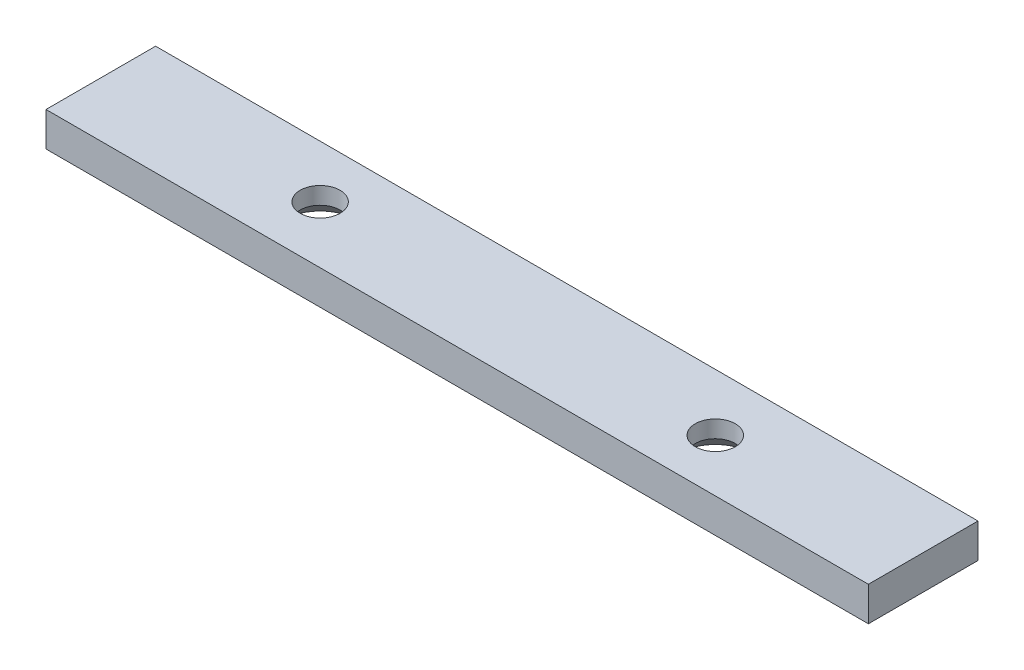
ISO-10303-21;
HEADER;
FILE_DESCRIPTION(('STEP AP214'),'2;1');
FILE_NAME('part.step','',(''),(''),'','','');
FILE_SCHEMA(('AUTOMOTIVE_DESIGN { 1 0 10303 214 1 1 1 1 }'));
ENDSEC;
DATA;
#1=APPLICATION_CONTEXT('core data for automotive mechanical design processes');
#2=APPLICATION_PROTOCOL_DEFINITION('international standard','automotive_design',2000,#1);
#3=PRODUCT_CONTEXT('',#1,'mechanical');
#4=PRODUCT('Part','Part','',(#3));
#5=PRODUCT_RELATED_PRODUCT_CATEGORY('part','',(#4));
#6=PRODUCT_DEFINITION_FORMATION('','',#4);
#7=PRODUCT_DEFINITION_CONTEXT('part definition',#1,'design');
#8=PRODUCT_DEFINITION('design','',#6,#7);
#9=PRODUCT_DEFINITION_SHAPE('','',#8);
#10=(LENGTH_UNIT() NAMED_UNIT(*) SI_UNIT(.MILLI.,.METRE.));
#11=(NAMED_UNIT(*) PLANE_ANGLE_UNIT() SI_UNIT($,.RADIAN.));
#12=(NAMED_UNIT(*) SI_UNIT($,.STERADIAN.) SOLID_ANGLE_UNIT());
#13=UNCERTAINTY_MEASURE_WITH_UNIT(LENGTH_MEASURE(1.E-05),#10,'distance_accuracy_value','');
#14=(GEOMETRIC_REPRESENTATION_CONTEXT(3) GLOBAL_UNCERTAINTY_ASSIGNED_CONTEXT((#13)) GLOBAL_UNIT_ASSIGNED_CONTEXT((#10,
#11,#12)) REPRESENTATION_CONTEXT('',''));
#15=CARTESIAN_POINT('',(0.,0.,0.));
#16=DIRECTION('',(0.,0.,1.));
#17=DIRECTION('',(1.,0.,0.));
#18=AXIS2_PLACEMENT_3D('',#15,#16,#17);
#19=CARTESIAN_POINT('',(0.,6.,-19.1941688478284));
#20=DIRECTION('',(0.,0.,1.));
#21=DIRECTION('',(1.,0.,0.));
#22=AXIS2_PLACEMENT_3D('',#19,#20,#21);
#23=PLANE('',#22);
#24=DIRECTION('',(-1.,0.,0.));
#25=VECTOR('',#24,1.);
#26=CARTESIAN_POINT('',(0.,0.,-19.1941688478284));
#27=LINE('',#26,#25);
#28=CARTESIAN_POINT('',(144.,0.,-19.1941688478284));
#29=VERTEX_POINT('',#28);
#30=CARTESIAN_POINT('',(0.,0.,-19.1941688478284));
#31=VERTEX_POINT('',#30);
#32=EDGE_CURVE('E106',#29,#31,#27,.T.);
#33=ORIENTED_EDGE('',*,*,#32,.T.);
#34=DIRECTION('',(0.,-1.,0.));
#35=VECTOR('',#34,1.);
#36=CARTESIAN_POINT('',(0.,6.,-19.1941688478284));
#37=LINE('',#36,#35);
#38=CARTESIAN_POINT('',(0.,6.,-19.1941688478284));
#39=VERTEX_POINT('',#38);
#40=EDGE_CURVE('E97',#39,#31,#37,.T.);
#41=ORIENTED_EDGE('',*,*,#40,.F.);
#42=DIRECTION('',(-1.,0.,0.));
#43=VECTOR('',#42,1.);
#44=CARTESIAN_POINT('',(0.,6.,-19.1941688478284));
#45=LINE('',#44,#43);
#46=CARTESIAN_POINT('',(144.,6.,-19.1941688478284));
#47=VERTEX_POINT('',#46);
#48=EDGE_CURVE('E91',#47,#39,#45,.T.);
#49=ORIENTED_EDGE('',*,*,#48,.F.);
#50=DIRECTION('',(0.,-1.,0.));
#51=VECTOR('',#50,1.);
#52=CARTESIAN_POINT('',(144.,6.,-19.1941688478284));
#53=LINE('',#52,#51);
#54=EDGE_CURVE('E102',#47,#29,#53,.T.);
#55=ORIENTED_EDGE('',*,*,#54,.T.);
#56=EDGE_LOOP('',(#33,#41,#49,#55));
#57=FACE_BOUND('',#56,.T.);
#58=ADVANCED_FACE('F37',(#57),#23,.F.);
#59=CARTESIAN_POINT('',(0.,6.,0.));
#60=DIRECTION('',(1.,0.,0.));
#61=DIRECTION('',(0.,0.,-1.));
#62=AXIS2_PLACEMENT_3D('',#59,#60,#61);
#63=PLANE('',#62);
#64=DIRECTION('',(0.,0.,1.));
#65=VECTOR('',#64,1.);
#66=CARTESIAN_POINT('',(0.,0.,0.));
#67=LINE('',#66,#65);
#68=CARTESIAN_POINT('',(0.,0.,0.));
#69=VERTEX_POINT('',#68);
#70=EDGE_CURVE('E96',#31,#69,#67,.T.);
#71=ORIENTED_EDGE('',*,*,#70,.T.);
#72=DIRECTION('',(0.,-1.,0.));
#73=VECTOR('',#72,1.);
#74=CARTESIAN_POINT('',(0.,6.,0.));
#75=LINE('',#74,#73);
#76=CARTESIAN_POINT('',(0.,6.,0.));
#77=VERTEX_POINT('',#76);
#78=EDGE_CURVE('E94',#77,#69,#75,.T.);
#79=ORIENTED_EDGE('',*,*,#78,.F.);
#80=DIRECTION('',(0.,0.,1.));
#81=VECTOR('',#80,1.);
#82=CARTESIAN_POINT('',(0.,6.,0.));
#83=LINE('',#82,#81);
#84=EDGE_CURVE('E86',#39,#77,#83,.T.);
#85=ORIENTED_EDGE('',*,*,#84,.F.);
#86=ORIENTED_EDGE('',*,*,#40,.T.);
#87=EDGE_LOOP('',(#71,#79,#85,#86));
#88=FACE_BOUND('',#87,.T.);
#89=ADVANCED_FACE('F95',(#88),#63,.F.);
#90=CARTESIAN_POINT('',(0.,6.,0.));
#91=DIRECTION('',(0.,0.,-1.));
#92=DIRECTION('',(-1.,0.,0.));
#93=AXIS2_PLACEMENT_3D('',#90,#91,#92);
#94=PLANE('',#93);
#95=DIRECTION('',(1.,0.,0.));
#96=VECTOR('',#95,1.);
#97=CARTESIAN_POINT('',(0.,0.,0.));
#98=LINE('',#97,#96);
#99=CARTESIAN_POINT('',(144.,0.,0.));
#100=VERTEX_POINT('',#99);
#101=EDGE_CURVE('E72',#69,#100,#98,.T.);
#102=ORIENTED_EDGE('',*,*,#101,.T.);
#103=DIRECTION('',(0.,-1.,0.));
#104=VECTOR('',#103,1.);
#105=CARTESIAN_POINT('',(144.,6.,0.));
#106=LINE('',#105,#104);
#107=CARTESIAN_POINT('',(144.,6.,0.));
#108=VERTEX_POINT('',#107);
#109=EDGE_CURVE('E98',#108,#100,#106,.T.);
#110=ORIENTED_EDGE('',*,*,#109,.F.);
#111=DIRECTION('',(1.,0.,0.));
#112=VECTOR('',#111,1.);
#113=CARTESIAN_POINT('',(0.,6.,0.));
#114=LINE('',#113,#112);
#115=EDGE_CURVE('E89',#77,#108,#114,.T.);
#116=ORIENTED_EDGE('',*,*,#115,.F.);
#117=ORIENTED_EDGE('',*,*,#78,.T.);
#118=EDGE_LOOP('',(#102,#110,#116,#117));
#119=FACE_BOUND('',#118,.T.);
#120=ADVANCED_FACE('F100',(#119),#94,.F.);
#121=CARTESIAN_POINT('',(38.,6.,-10.));
#122=DIRECTION('',(0.,-1.,0.));
#123=DIRECTION('',(0.,0.,-1.));
#124=AXIS2_PLACEMENT_3D('',#121,#122,#123);
#125=CYLINDRICAL_SURFACE('',#124,3.5);
#126=CARTESIAN_POINT('',(38.,3.00000000000001,-10.));
#127=DIRECTION('',(0.,1.,0.));
#128=DIRECTION('',(0.,0.,1.));
#129=AXIS2_PLACEMENT_3D('',#126,#127,#128);
#130=CIRCLE('',#129,3.5);
#131=CARTESIAN_POINT('',(38.,3.00000000000001,-6.5));
#132=VERTEX_POINT('',#131);
#133=EDGE_CURVE('E47',#132,#132,#130,.F.);
#134=ORIENTED_EDGE('',*,*,#133,.T.);
#135=EDGE_LOOP('',(#134));
#136=FACE_BOUND('',#135,.T.);
#137=CARTESIAN_POINT('',(38.,6.,-10.));
#138=DIRECTION('',(0.,1.,0.));
#139=DIRECTION('',(0.,0.,1.));
#140=AXIS2_PLACEMENT_3D('',#137,#138,#139);
#141=CIRCLE('',#140,3.5);
#142=CARTESIAN_POINT('',(38.,6.,-6.5));
#143=VERTEX_POINT('',#142);
#144=EDGE_CURVE('E210',#143,#143,#141,.T.);
#145=ORIENTED_EDGE('',*,*,#144,.T.);
#146=EDGE_LOOP('',(#145));
#147=FACE_BOUND('',#146,.T.);
#148=ADVANCED_FACE('F124',(#136,#147),#125,.F.);
#149=CARTESIAN_POINT('',(108.,6.,-9.1941688478284));
#150=DIRECTION('',(0.,-1.,0.));
#151=DIRECTION('',(0.,0.,-1.));
#152=AXIS2_PLACEMENT_3D('',#149,#150,#151);
#153=CYLINDRICAL_SURFACE('',#152,3.49999999999999);
#154=CARTESIAN_POINT('',(108.,3.00000000000001,-9.1941688478284));
#155=DIRECTION('',(0.,1.,0.));
#156=DIRECTION('',(0.,0.,1.));
#157=AXIS2_PLACEMENT_3D('',#154,#155,#156);
#158=CIRCLE('',#157,3.49999999999999);
#159=CARTESIAN_POINT('',(108.,3.00000000000001,-5.69416884782841));
#160=VERTEX_POINT('',#159);
#161=EDGE_CURVE('E11',#160,#160,#158,.F.);
#162=ORIENTED_EDGE('',*,*,#161,.T.);
#163=EDGE_LOOP('',(#162));
#164=FACE_BOUND('',#163,.T.);
#165=CARTESIAN_POINT('',(108.,6.,-9.1941688478284));
#166=DIRECTION('',(0.,1.,0.));
#167=DIRECTION('',(0.,0.,1.));
#168=AXIS2_PLACEMENT_3D('',#165,#166,#167);
#169=CIRCLE('',#168,3.49999999999999);
#170=CARTESIAN_POINT('',(108.,6.,-5.69416884782841));
#171=VERTEX_POINT('',#170);
#172=EDGE_CURVE('E112',#171,#171,#169,.T.);
#173=ORIENTED_EDGE('',*,*,#172,.T.);
#174=EDGE_LOOP('',(#173));
#175=FACE_BOUND('',#174,.T.);
#176=ADVANCED_FACE('F142',(#164,#175),#153,.F.);
#177=CARTESIAN_POINT('',(144.,6.,0.));
#178=DIRECTION('',(-1.,0.,0.));
#179=DIRECTION('',(0.,0.,1.));
#180=AXIS2_PLACEMENT_3D('',#177,#178,#179);
#181=PLANE('',#180);
#182=DIRECTION('',(0.,0.,-1.));
#183=VECTOR('',#182,1.);
#184=CARTESIAN_POINT('',(144.,0.,0.));
#185=LINE('',#184,#183);
#186=EDGE_CURVE('E78',#100,#29,#185,.T.);
#187=ORIENTED_EDGE('',*,*,#186,.T.);
#188=ORIENTED_EDGE('',*,*,#54,.F.);
#189=DIRECTION('',(0.,0.,-1.));
#190=VECTOR('',#189,1.);
#191=CARTESIAN_POINT('',(144.,6.,0.));
#192=LINE('',#191,#190);
#193=EDGE_CURVE('E55',#108,#47,#192,.T.);
#194=ORIENTED_EDGE('',*,*,#193,.F.);
#195=ORIENTED_EDGE('',*,*,#109,.T.);
#196=EDGE_LOOP('',(#187,#188,#194,#195));
#197=FACE_BOUND('',#196,.T.);
#198=ADVANCED_FACE('F140',(#197),#181,.F.);
#199=CARTESIAN_POINT('',(0.,6.,0.));
#200=DIRECTION('',(0.,1.,0.));
#201=DIRECTION('',(0.,0.,1.));
#202=AXIS2_PLACEMENT_3D('',#199,#200,#201);
#203=PLANE('',#202);
#204=ORIENTED_EDGE('',*,*,#172,.F.);
#205=EDGE_LOOP('',(#204));
#206=FACE_BOUND('',#205,.T.);
#207=ORIENTED_EDGE('',*,*,#144,.F.);
#208=EDGE_LOOP('',(#207));
#209=FACE_BOUND('',#208,.T.);
#210=ORIENTED_EDGE('',*,*,#48,.T.);
#211=ORIENTED_EDGE('',*,*,#84,.T.);
#212=ORIENTED_EDGE('',*,*,#115,.T.);
#213=ORIENTED_EDGE('',*,*,#193,.T.);
#214=EDGE_LOOP('',(#210,#211,#212,#213));
#215=FACE_BOUND('',#214,.T.);
#216=ADVANCED_FACE('F87',(#206,#209,#215),#203,.T.);
#217=CARTESIAN_POINT('',(0.,0.,0.));
#218=DIRECTION('',(0.,1.,0.));
#219=DIRECTION('',(0.,0.,1.));
#220=AXIS2_PLACEMENT_3D('',#217,#218,#219);
#221=PLANE('',#220);
#222=CARTESIAN_POINT('',(38.,0.,-10.));
#223=DIRECTION('',(0.,1.,0.));
#224=DIRECTION('',(0.,0.,1.));
#225=AXIS2_PLACEMENT_3D('',#222,#223,#224);
#226=CIRCLE('',#225,6.49999999999998);
#227=CARTESIAN_POINT('',(38.,0.,-3.50000000000002));
#228=VERTEX_POINT('',#227);
#229=EDGE_CURVE('E119',#228,#228,#226,.T.);
#230=ORIENTED_EDGE('',*,*,#229,.T.);
#231=EDGE_LOOP('',(#230));
#232=FACE_BOUND('',#231,.T.);
#233=CARTESIAN_POINT('',(108.,0.,-9.1941688478284));
#234=DIRECTION('',(0.,1.,0.));
#235=DIRECTION('',(0.,0.,1.));
#236=AXIS2_PLACEMENT_3D('',#233,#234,#235);
#237=CIRCLE('',#236,6.49999999999998);
#238=CARTESIAN_POINT('',(108.,0.,-2.69416884782842));
#239=VERTEX_POINT('',#238);
#240=EDGE_CURVE('E116',#239,#239,#237,.T.);
#241=ORIENTED_EDGE('',*,*,#240,.T.);
#242=EDGE_LOOP('',(#241));
#243=FACE_BOUND('',#242,.T.);
#244=ORIENTED_EDGE('',*,*,#32,.F.);
#245=ORIENTED_EDGE('',*,*,#186,.F.);
#246=ORIENTED_EDGE('',*,*,#101,.F.);
#247=ORIENTED_EDGE('',*,*,#70,.F.);
#248=EDGE_LOOP('',(#244,#245,#246,#247));
#249=FACE_BOUND('',#248,.T.);
#250=ADVANCED_FACE('F130',(#232,#243,#249),#221,.F.);
#251=CARTESIAN_POINT('',(38.,0.,-10.));
#252=DIRECTION('',(0.,-1.,0.));
#253=DIRECTION('',(0.,0.,-1.));
#254=AXIS2_PLACEMENT_3D('',#251,#252,#253);
#255=CONICAL_SURFACE('',#254,6.49999999999998,0.785398163397444);
#256=ORIENTED_EDGE('',*,*,#133,.F.);
#257=EDGE_LOOP('',(#256));
#258=FACE_BOUND('',#257,.T.);
#259=ORIENTED_EDGE('',*,*,#229,.F.);
#260=EDGE_LOOP('',(#259));
#261=FACE_BOUND('',#260,.T.);
#262=ADVANCED_FACE('F127',(#258,#261),#255,.F.);
#263=CARTESIAN_POINT('',(108.,0.,-9.1941688478284));
#264=DIRECTION('',(0.,-1.,0.));
#265=DIRECTION('',(0.,0.,-1.));
#266=AXIS2_PLACEMENT_3D('',#263,#264,#265);
#267=CONICAL_SURFACE('',#266,6.49999999999998,0.785398163397444);
#268=ORIENTED_EDGE('',*,*,#161,.F.);
#269=EDGE_LOOP('',(#268));
#270=FACE_BOUND('',#269,.T.);
#271=ORIENTED_EDGE('',*,*,#240,.F.);
#272=EDGE_LOOP('',(#271));
#273=FACE_BOUND('',#272,.T.);
#274=ADVANCED_FACE('F40',(#270,#273),#267,.F.);
#275=CLOSED_SHELL('',(#58,#89,#120,#148,#176,#198,#216,#250,#262,#274));
#276=MANIFOLD_SOLID_BREP('B2',#275);
#277=ADVANCED_BREP_SHAPE_REPRESENTATION('',(#18,#276),#14);
#278=SHAPE_DEFINITION_REPRESENTATION(#9,#277);
ENDSEC;
END-ISO-10303-21;
